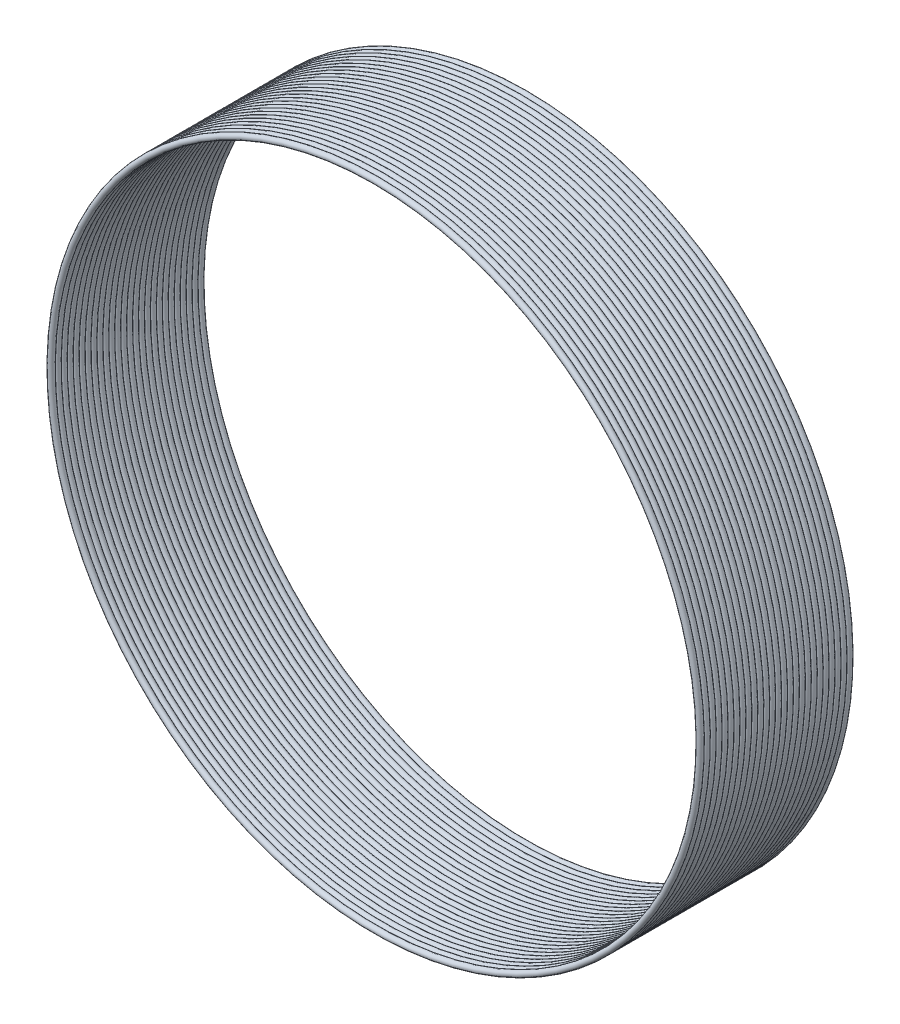
ISO-10303-21;
HEADER;
FILE_DESCRIPTION(('STEP AP214'),'2;1');
FILE_NAME('part.step','',(''),(''),'','','');
FILE_SCHEMA(('AUTOMOTIVE_DESIGN { 1 0 10303 214 1 1 1 1 }'));
ENDSEC;
DATA;
#1=APPLICATION_CONTEXT('core data for automotive mechanical design processes');
#2=APPLICATION_PROTOCOL_DEFINITION('international standard','automotive_design',2000,#1);
#3=PRODUCT_CONTEXT('',#1,'mechanical');
#4=PRODUCT('Part','Part','',(#3));
#5=PRODUCT_RELATED_PRODUCT_CATEGORY('part','',(#4));
#6=PRODUCT_DEFINITION_FORMATION('','',#4);
#7=PRODUCT_DEFINITION_CONTEXT('part definition',#1,'design');
#8=PRODUCT_DEFINITION('design','',#6,#7);
#9=PRODUCT_DEFINITION_SHAPE('','',#8);
#10=(LENGTH_UNIT() NAMED_UNIT(*) SI_UNIT(.MILLI.,.METRE.));
#11=(NAMED_UNIT(*) PLANE_ANGLE_UNIT() SI_UNIT($,.RADIAN.));
#12=(NAMED_UNIT(*) SI_UNIT($,.STERADIAN.) SOLID_ANGLE_UNIT());
#13=UNCERTAINTY_MEASURE_WITH_UNIT(LENGTH_MEASURE(1.E-05),#10,'distance_accuracy_value','');
#14=(GEOMETRIC_REPRESENTATION_CONTEXT(3) GLOBAL_UNCERTAINTY_ASSIGNED_CONTEXT((#13)) GLOBAL_UNIT_ASSIGNED_CONTEXT((#10,
#11,#12)) REPRESENTATION_CONTEXT('',''));
#15=CARTESIAN_POINT('',(0.,0.,0.));
#16=DIRECTION('',(0.,0.,1.));
#17=DIRECTION('',(1.,0.,0.));
#18=AXIS2_PLACEMENT_3D('',#15,#16,#17);
#19=CARTESIAN_POINT('',(0.,0.,-41.76));
#20=DIRECTION('',(0.,0.,-1.));
#21=DIRECTION('',(-1.,0.,0.));
#22=AXIS2_PLACEMENT_3D('',#19,#20,#21);
#23=TOROIDAL_SURFACE('',#22,95.,0.875000000000001);
#24=CARTESIAN_POINT('',(0.,0.,-42.63));
#25=DIRECTION('',(0.,0.,1.));
#26=DIRECTION('',(1.,0.,0.));
#27=AXIS2_PLACEMENT_3D('',#24,#25,#26);
#28=CIRCLE('',#27,94.9065922915465);
#29=CARTESIAN_POINT('',(0.,94.9065922915426,-42.63));
#30=VERTEX_POINT('',#29);
#31=EDGE_CURVE('E11',#30,#30,#28,.T.);
#32=ORIENTED_EDGE('',*,*,#31,.F.);
#33=CARTESIAN_POINT('',(0.,95.,-41.76));
#34=DIRECTION('',(1.,0.,0.));
#35=DIRECTION('',(0.,0.,-1.));
#36=AXIS2_PLACEMENT_3D('',#33,#34,#35);
#37=CIRCLE('',#36,0.875000000000001);
#38=CARTESIAN_POINT('',(0.,94.9065922915426,-40.89));
#39=VERTEX_POINT('',#38);
#40=EDGE_CURVE('E207',#39,#30,#37,.T.);
#41=ORIENTED_EDGE('',*,*,#40,.F.);
#42=CARTESIAN_POINT('',(0.,0.,-40.89));
#43=DIRECTION('',(0.,0.,1.));
#44=DIRECTION('',(1.,0.,0.));
#45=AXIS2_PLACEMENT_3D('',#42,#43,#44);
#46=CIRCLE('',#45,94.9065922915465);
#47=EDGE_CURVE('E420',#39,#39,#46,.T.);
#48=ORIENTED_EDGE('',*,*,#47,.T.);
#49=ORIENTED_EDGE('',*,*,#40,.T.);
#50=EDGE_LOOP('',(#32,#41,#48,#49));
#51=FACE_BOUND('',#50,.T.);
#52=ADVANCED_FACE('F32',(#51),#23,.T.);
#53=CARTESIAN_POINT('',(0.,0.,-40.02));
#54=DIRECTION('',(0.,0.,-1.));
#55=DIRECTION('',(-1.,0.,0.));
#56=AXIS2_PLACEMENT_3D('',#53,#54,#55);
#57=TOROIDAL_SURFACE('',#56,95.,0.875000000000001);
#58=ORIENTED_EDGE('',*,*,#47,.F.);
#59=CARTESIAN_POINT('',(0.,95.,-40.02));
#60=DIRECTION('',(1.,0.,0.));
#61=DIRECTION('',(0.,0.,-1.));
#62=AXIS2_PLACEMENT_3D('',#59,#60,#61);
#63=CIRCLE('',#62,0.875000000000001);
#64=CARTESIAN_POINT('',(0.,94.9065922915426,-39.15));
#65=VERTEX_POINT('',#64);
#66=EDGE_CURVE('E214',#65,#39,#63,.T.);
#67=ORIENTED_EDGE('',*,*,#66,.F.);
#68=CARTESIAN_POINT('',(0.,0.,-39.15));
#69=DIRECTION('',(0.,0.,1.));
#70=DIRECTION('',(1.,0.,0.));
#71=AXIS2_PLACEMENT_3D('',#68,#69,#70);
#72=CIRCLE('',#71,94.9065922915465);
#73=EDGE_CURVE('E416',#65,#65,#72,.T.);
#74=ORIENTED_EDGE('',*,*,#73,.T.);
#75=ORIENTED_EDGE('',*,*,#66,.T.);
#76=EDGE_LOOP('',(#58,#67,#74,#75));
#77=FACE_BOUND('',#76,.T.);
#78=ADVANCED_FACE('F431',(#77),#57,.T.);
#79=CARTESIAN_POINT('',(0.,0.,-38.28));
#80=DIRECTION('',(0.,0.,-1.));
#81=DIRECTION('',(-1.,0.,0.));
#82=AXIS2_PLACEMENT_3D('',#79,#80,#81);
#83=TOROIDAL_SURFACE('',#82,95.,0.875000000000001);
#84=ORIENTED_EDGE('',*,*,#73,.F.);
#85=CARTESIAN_POINT('',(0.,95.,-38.28));
#86=DIRECTION('',(1.,0.,0.));
#87=DIRECTION('',(0.,0.,-1.));
#88=AXIS2_PLACEMENT_3D('',#85,#86,#87);
#89=CIRCLE('',#88,0.875000000000001);
#90=CARTESIAN_POINT('',(0.,94.9065922915426,-37.41));
#91=VERTEX_POINT('',#90);
#92=EDGE_CURVE('E217',#91,#65,#89,.T.);
#93=ORIENTED_EDGE('',*,*,#92,.F.);
#94=CARTESIAN_POINT('',(0.,0.,-37.41));
#95=DIRECTION('',(0.,0.,1.));
#96=DIRECTION('',(1.,0.,0.));
#97=AXIS2_PLACEMENT_3D('',#94,#95,#96);
#98=CIRCLE('',#97,94.9065922915465);
#99=EDGE_CURVE('E410',#91,#91,#98,.T.);
#100=ORIENTED_EDGE('',*,*,#99,.T.);
#101=ORIENTED_EDGE('',*,*,#92,.T.);
#102=EDGE_LOOP('',(#84,#93,#100,#101));
#103=FACE_BOUND('',#102,.T.);
#104=ADVANCED_FACE('F435',(#103),#83,.T.);
#105=CARTESIAN_POINT('',(0.,0.,-36.54));
#106=DIRECTION('',(0.,0.,-1.));
#107=DIRECTION('',(-1.,0.,0.));
#108=AXIS2_PLACEMENT_3D('',#105,#106,#107);
#109=TOROIDAL_SURFACE('',#108,95.,0.875000000000001);
#110=ORIENTED_EDGE('',*,*,#99,.F.);
#111=CARTESIAN_POINT('',(0.,95.,-36.54));
#112=DIRECTION('',(1.,0.,0.));
#113=DIRECTION('',(0.,0.,-1.));
#114=AXIS2_PLACEMENT_3D('',#111,#112,#113);
#115=CIRCLE('',#114,0.875000000000001);
#116=CARTESIAN_POINT('',(0.,94.9065922915426,-35.67));
#117=VERTEX_POINT('',#116);
#118=EDGE_CURVE('E220',#117,#91,#115,.T.);
#119=ORIENTED_EDGE('',*,*,#118,.F.);
#120=CARTESIAN_POINT('',(0.,0.,-35.67));
#121=DIRECTION('',(0.,0.,1.));
#122=DIRECTION('',(1.,0.,0.));
#123=AXIS2_PLACEMENT_3D('',#120,#121,#122);
#124=CIRCLE('',#123,94.9065922915465);
#125=EDGE_CURVE('E404',#117,#117,#124,.T.);
#126=ORIENTED_EDGE('',*,*,#125,.T.);
#127=ORIENTED_EDGE('',*,*,#118,.T.);
#128=EDGE_LOOP('',(#110,#119,#126,#127));
#129=FACE_BOUND('',#128,.T.);
#130=ADVANCED_FACE('F439',(#129),#109,.T.);
#131=CARTESIAN_POINT('',(0.,0.,-34.8));
#132=DIRECTION('',(0.,0.,-1.));
#133=DIRECTION('',(-1.,0.,0.));
#134=AXIS2_PLACEMENT_3D('',#131,#132,#133);
#135=TOROIDAL_SURFACE('',#134,95.,0.875000000000001);
#136=ORIENTED_EDGE('',*,*,#125,.F.);
#137=CARTESIAN_POINT('',(0.,95.,-34.8));
#138=DIRECTION('',(1.,0.,0.));
#139=DIRECTION('',(0.,0.,-1.));
#140=AXIS2_PLACEMENT_3D('',#137,#138,#139);
#141=CIRCLE('',#140,0.875000000000001);
#142=CARTESIAN_POINT('',(0.,94.9065922915426,-33.93));
#143=VERTEX_POINT('',#142);
#144=EDGE_CURVE('E223',#143,#117,#141,.T.);
#145=ORIENTED_EDGE('',*,*,#144,.F.);
#146=CARTESIAN_POINT('',(0.,0.,-33.93));
#147=DIRECTION('',(0.,0.,1.));
#148=DIRECTION('',(1.,0.,0.));
#149=AXIS2_PLACEMENT_3D('',#146,#147,#148);
#150=CIRCLE('',#149,94.9065922915465);
#151=EDGE_CURVE('E398',#143,#143,#150,.T.);
#152=ORIENTED_EDGE('',*,*,#151,.T.);
#153=ORIENTED_EDGE('',*,*,#144,.T.);
#154=EDGE_LOOP('',(#136,#145,#152,#153));
#155=FACE_BOUND('',#154,.T.);
#156=ADVANCED_FACE('F443',(#155),#135,.T.);
#157=CARTESIAN_POINT('',(0.,0.,-33.06));
#158=DIRECTION('',(0.,0.,-1.));
#159=DIRECTION('',(-1.,0.,0.));
#160=AXIS2_PLACEMENT_3D('',#157,#158,#159);
#161=TOROIDAL_SURFACE('',#160,95.,0.875000000000001);
#162=ORIENTED_EDGE('',*,*,#151,.F.);
#163=CARTESIAN_POINT('',(0.,95.,-33.06));
#164=DIRECTION('',(1.,0.,0.));
#165=DIRECTION('',(0.,0.,-1.));
#166=AXIS2_PLACEMENT_3D('',#163,#164,#165);
#167=CIRCLE('',#166,0.875000000000001);
#168=CARTESIAN_POINT('',(0.,94.9065922915426,-32.19));
#169=VERTEX_POINT('',#168);
#170=EDGE_CURVE('E226',#169,#143,#167,.T.);
#171=ORIENTED_EDGE('',*,*,#170,.F.);
#172=CARTESIAN_POINT('',(0.,0.,-32.19));
#173=DIRECTION('',(0.,0.,1.));
#174=DIRECTION('',(1.,0.,0.));
#175=AXIS2_PLACEMENT_3D('',#172,#173,#174);
#176=CIRCLE('',#175,94.9065922915465);
#177=EDGE_CURVE('E392',#169,#169,#176,.T.);
#178=ORIENTED_EDGE('',*,*,#177,.T.);
#179=ORIENTED_EDGE('',*,*,#170,.T.);
#180=EDGE_LOOP('',(#162,#171,#178,#179));
#181=FACE_BOUND('',#180,.T.);
#182=ADVANCED_FACE('F447',(#181),#161,.T.);
#183=CARTESIAN_POINT('',(0.,0.,-31.32));
#184=DIRECTION('',(0.,0.,-1.));
#185=DIRECTION('',(-1.,0.,0.));
#186=AXIS2_PLACEMENT_3D('',#183,#184,#185);
#187=TOROIDAL_SURFACE('',#186,95.,0.875000000000001);
#188=ORIENTED_EDGE('',*,*,#177,.F.);
#189=CARTESIAN_POINT('',(0.,95.,-31.32));
#190=DIRECTION('',(1.,0.,0.));
#191=DIRECTION('',(0.,0.,-1.));
#192=AXIS2_PLACEMENT_3D('',#189,#190,#191);
#193=CIRCLE('',#192,0.875000000000001);
#194=CARTESIAN_POINT('',(0.,94.9065922915426,-30.45));
#195=VERTEX_POINT('',#194);
#196=EDGE_CURVE('E229',#195,#169,#193,.T.);
#197=ORIENTED_EDGE('',*,*,#196,.F.);
#198=CARTESIAN_POINT('',(0.,0.,-30.45));
#199=DIRECTION('',(0.,0.,1.));
#200=DIRECTION('',(1.,0.,0.));
#201=AXIS2_PLACEMENT_3D('',#198,#199,#200);
#202=CIRCLE('',#201,94.9065922915465);
#203=EDGE_CURVE('E386',#195,#195,#202,.T.);
#204=ORIENTED_EDGE('',*,*,#203,.T.);
#205=ORIENTED_EDGE('',*,*,#196,.T.);
#206=EDGE_LOOP('',(#188,#197,#204,#205));
#207=FACE_BOUND('',#206,.T.);
#208=ADVANCED_FACE('F451',(#207),#187,.T.);
#209=CARTESIAN_POINT('',(0.,0.,-29.58));
#210=DIRECTION('',(0.,0.,-1.));
#211=DIRECTION('',(-1.,0.,0.));
#212=AXIS2_PLACEMENT_3D('',#209,#210,#211);
#213=TOROIDAL_SURFACE('',#212,95.,0.875000000000001);
#214=ORIENTED_EDGE('',*,*,#203,.F.);
#215=CARTESIAN_POINT('',(0.,95.,-29.58));
#216=DIRECTION('',(1.,0.,0.));
#217=DIRECTION('',(0.,0.,-1.));
#218=AXIS2_PLACEMENT_3D('',#215,#216,#217);
#219=CIRCLE('',#218,0.875000000000001);
#220=CARTESIAN_POINT('',(0.,94.9065922915426,-28.71));
#221=VERTEX_POINT('',#220);
#222=EDGE_CURVE('E232',#221,#195,#219,.T.);
#223=ORIENTED_EDGE('',*,*,#222,.F.);
#224=CARTESIAN_POINT('',(0.,0.,-28.71));
#225=DIRECTION('',(0.,0.,1.));
#226=DIRECTION('',(1.,0.,0.));
#227=AXIS2_PLACEMENT_3D('',#224,#225,#226);
#228=CIRCLE('',#227,94.9065922915465);
#229=EDGE_CURVE('E380',#221,#221,#228,.T.);
#230=ORIENTED_EDGE('',*,*,#229,.T.);
#231=ORIENTED_EDGE('',*,*,#222,.T.);
#232=EDGE_LOOP('',(#214,#223,#230,#231));
#233=FACE_BOUND('',#232,.T.);
#234=ADVANCED_FACE('F455',(#233),#213,.T.);
#235=CARTESIAN_POINT('',(0.,0.,-27.84));
#236=DIRECTION('',(0.,0.,-1.));
#237=DIRECTION('',(-1.,0.,0.));
#238=AXIS2_PLACEMENT_3D('',#235,#236,#237);
#239=TOROIDAL_SURFACE('',#238,95.,0.875000000000001);
#240=ORIENTED_EDGE('',*,*,#229,.F.);
#241=CARTESIAN_POINT('',(0.,95.,-27.84));
#242=DIRECTION('',(1.,0.,0.));
#243=DIRECTION('',(0.,0.,-1.));
#244=AXIS2_PLACEMENT_3D('',#241,#242,#243);
#245=CIRCLE('',#244,0.875000000000001);
#246=CARTESIAN_POINT('',(0.,94.9065922915426,-26.97));
#247=VERTEX_POINT('',#246);
#248=EDGE_CURVE('E235',#247,#221,#245,.T.);
#249=ORIENTED_EDGE('',*,*,#248,.F.);
#250=CARTESIAN_POINT('',(0.,0.,-26.97));
#251=DIRECTION('',(0.,0.,1.));
#252=DIRECTION('',(1.,0.,0.));
#253=AXIS2_PLACEMENT_3D('',#250,#251,#252);
#254=CIRCLE('',#253,94.9065922915465);
#255=EDGE_CURVE('E374',#247,#247,#254,.T.);
#256=ORIENTED_EDGE('',*,*,#255,.T.);
#257=ORIENTED_EDGE('',*,*,#248,.T.);
#258=EDGE_LOOP('',(#240,#249,#256,#257));
#259=FACE_BOUND('',#258,.T.);
#260=ADVANCED_FACE('F459',(#259),#239,.T.);
#261=CARTESIAN_POINT('',(0.,0.,-26.1));
#262=DIRECTION('',(0.,0.,-1.));
#263=DIRECTION('',(-1.,0.,0.));
#264=AXIS2_PLACEMENT_3D('',#261,#262,#263);
#265=TOROIDAL_SURFACE('',#264,95.,0.875000000000001);
#266=ORIENTED_EDGE('',*,*,#255,.F.);
#267=CARTESIAN_POINT('',(0.,95.,-26.1));
#268=DIRECTION('',(1.,0.,0.));
#269=DIRECTION('',(0.,0.,-1.));
#270=AXIS2_PLACEMENT_3D('',#267,#268,#269);
#271=CIRCLE('',#270,0.875000000000001);
#272=CARTESIAN_POINT('',(0.,94.9065922915426,-25.23));
#273=VERTEX_POINT('',#272);
#274=EDGE_CURVE('E238',#273,#247,#271,.T.);
#275=ORIENTED_EDGE('',*,*,#274,.F.);
#276=CARTESIAN_POINT('',(0.,0.,-25.23));
#277=DIRECTION('',(0.,0.,1.));
#278=DIRECTION('',(1.,0.,0.));
#279=AXIS2_PLACEMENT_3D('',#276,#277,#278);
#280=CIRCLE('',#279,94.9065922915465);
#281=EDGE_CURVE('E368',#273,#273,#280,.T.);
#282=ORIENTED_EDGE('',*,*,#281,.T.);
#283=ORIENTED_EDGE('',*,*,#274,.T.);
#284=EDGE_LOOP('',(#266,#275,#282,#283));
#285=FACE_BOUND('',#284,.T.);
#286=ADVANCED_FACE('F463',(#285),#265,.T.);
#287=CARTESIAN_POINT('',(0.,0.,-24.36));
#288=DIRECTION('',(0.,0.,-1.));
#289=DIRECTION('',(-1.,0.,0.));
#290=AXIS2_PLACEMENT_3D('',#287,#288,#289);
#291=TOROIDAL_SURFACE('',#290,95.,0.875000000000001);
#292=ORIENTED_EDGE('',*,*,#281,.F.);
#293=CARTESIAN_POINT('',(0.,95.,-24.36));
#294=DIRECTION('',(1.,0.,0.));
#295=DIRECTION('',(0.,0.,-1.));
#296=AXIS2_PLACEMENT_3D('',#293,#294,#295);
#297=CIRCLE('',#296,0.875000000000001);
#298=CARTESIAN_POINT('',(0.,94.9065922915426,-23.49));
#299=VERTEX_POINT('',#298);
#300=EDGE_CURVE('E241',#299,#273,#297,.T.);
#301=ORIENTED_EDGE('',*,*,#300,.F.);
#302=CARTESIAN_POINT('',(0.,0.,-23.49));
#303=DIRECTION('',(0.,0.,1.));
#304=DIRECTION('',(1.,0.,0.));
#305=AXIS2_PLACEMENT_3D('',#302,#303,#304);
#306=CIRCLE('',#305,94.9065922915465);
#307=EDGE_CURVE('E362',#299,#299,#306,.T.);
#308=ORIENTED_EDGE('',*,*,#307,.T.);
#309=ORIENTED_EDGE('',*,*,#300,.T.);
#310=EDGE_LOOP('',(#292,#301,#308,#309));
#311=FACE_BOUND('',#310,.T.);
#312=ADVANCED_FACE('F467',(#311),#291,.T.);
#313=CARTESIAN_POINT('',(0.,0.,-22.62));
#314=DIRECTION('',(0.,0.,-1.));
#315=DIRECTION('',(-1.,0.,0.));
#316=AXIS2_PLACEMENT_3D('',#313,#314,#315);
#317=TOROIDAL_SURFACE('',#316,95.,0.875000000000001);
#318=ORIENTED_EDGE('',*,*,#307,.F.);
#319=CARTESIAN_POINT('',(0.,95.,-22.62));
#320=DIRECTION('',(1.,0.,0.));
#321=DIRECTION('',(0.,0.,-1.));
#322=AXIS2_PLACEMENT_3D('',#319,#320,#321);
#323=CIRCLE('',#322,0.875000000000001);
#324=CARTESIAN_POINT('',(0.,94.9065922915426,-21.75));
#325=VERTEX_POINT('',#324);
#326=EDGE_CURVE('E244',#325,#299,#323,.T.);
#327=ORIENTED_EDGE('',*,*,#326,.F.);
#328=CARTESIAN_POINT('',(0.,0.,-21.75));
#329=DIRECTION('',(0.,0.,1.));
#330=DIRECTION('',(1.,0.,0.));
#331=AXIS2_PLACEMENT_3D('',#328,#329,#330);
#332=CIRCLE('',#331,94.9065922915465);
#333=EDGE_CURVE('E356',#325,#325,#332,.T.);
#334=ORIENTED_EDGE('',*,*,#333,.T.);
#335=ORIENTED_EDGE('',*,*,#326,.T.);
#336=EDGE_LOOP('',(#318,#327,#334,#335));
#337=FACE_BOUND('',#336,.T.);
#338=ADVANCED_FACE('F471',(#337),#317,.T.);
#339=CARTESIAN_POINT('',(0.,0.,-20.88));
#340=DIRECTION('',(0.,0.,-1.));
#341=DIRECTION('',(-1.,0.,0.));
#342=AXIS2_PLACEMENT_3D('',#339,#340,#341);
#343=TOROIDAL_SURFACE('',#342,95.,0.875000000000001);
#344=ORIENTED_EDGE('',*,*,#333,.F.);
#345=CARTESIAN_POINT('',(0.,95.,-20.88));
#346=DIRECTION('',(1.,0.,0.));
#347=DIRECTION('',(0.,0.,-1.));
#348=AXIS2_PLACEMENT_3D('',#345,#346,#347);
#349=CIRCLE('',#348,0.875000000000001);
#350=CARTESIAN_POINT('',(0.,94.9065922915426,-20.01));
#351=VERTEX_POINT('',#350);
#352=EDGE_CURVE('E247',#351,#325,#349,.T.);
#353=ORIENTED_EDGE('',*,*,#352,.F.);
#354=CARTESIAN_POINT('',(0.,0.,-20.01));
#355=DIRECTION('',(0.,0.,1.));
#356=DIRECTION('',(1.,0.,0.));
#357=AXIS2_PLACEMENT_3D('',#354,#355,#356);
#358=CIRCLE('',#357,94.9065922915465);
#359=EDGE_CURVE('E350',#351,#351,#358,.T.);
#360=ORIENTED_EDGE('',*,*,#359,.T.);
#361=ORIENTED_EDGE('',*,*,#352,.T.);
#362=EDGE_LOOP('',(#344,#353,#360,#361));
#363=FACE_BOUND('',#362,.T.);
#364=ADVANCED_FACE('F475',(#363),#343,.T.);
#365=CARTESIAN_POINT('',(0.,0.,-19.14));
#366=DIRECTION('',(0.,0.,-1.));
#367=DIRECTION('',(-1.,0.,0.));
#368=AXIS2_PLACEMENT_3D('',#365,#366,#367);
#369=TOROIDAL_SURFACE('',#368,95.,0.875000000000001);
#370=ORIENTED_EDGE('',*,*,#359,.F.);
#371=CARTESIAN_POINT('',(0.,95.,-19.14));
#372=DIRECTION('',(1.,0.,0.));
#373=DIRECTION('',(0.,0.,-1.));
#374=AXIS2_PLACEMENT_3D('',#371,#372,#373);
#375=CIRCLE('',#374,0.875000000000001);
#376=CARTESIAN_POINT('',(0.,94.9065922915426,-18.27));
#377=VERTEX_POINT('',#376);
#378=EDGE_CURVE('E250',#377,#351,#375,.T.);
#379=ORIENTED_EDGE('',*,*,#378,.F.);
#380=CARTESIAN_POINT('',(0.,0.,-18.27));
#381=DIRECTION('',(0.,0.,1.));
#382=DIRECTION('',(1.,0.,0.));
#383=AXIS2_PLACEMENT_3D('',#380,#381,#382);
#384=CIRCLE('',#383,94.9065922915465);
#385=EDGE_CURVE('E344',#377,#377,#384,.T.);
#386=ORIENTED_EDGE('',*,*,#385,.T.);
#387=ORIENTED_EDGE('',*,*,#378,.T.);
#388=EDGE_LOOP('',(#370,#379,#386,#387));
#389=FACE_BOUND('',#388,.T.);
#390=ADVANCED_FACE('F479',(#389),#369,.T.);
#391=CARTESIAN_POINT('',(0.,0.,-17.4));
#392=DIRECTION('',(0.,0.,-1.));
#393=DIRECTION('',(-1.,0.,0.));
#394=AXIS2_PLACEMENT_3D('',#391,#392,#393);
#395=TOROIDAL_SURFACE('',#394,95.,0.875000000000001);
#396=ORIENTED_EDGE('',*,*,#385,.F.);
#397=CARTESIAN_POINT('',(0.,95.,-17.4));
#398=DIRECTION('',(1.,0.,0.));
#399=DIRECTION('',(0.,0.,-1.));
#400=AXIS2_PLACEMENT_3D('',#397,#398,#399);
#401=CIRCLE('',#400,0.875000000000001);
#402=CARTESIAN_POINT('',(0.,94.9065922915426,-16.53));
#403=VERTEX_POINT('',#402);
#404=EDGE_CURVE('E253',#403,#377,#401,.T.);
#405=ORIENTED_EDGE('',*,*,#404,.F.);
#406=CARTESIAN_POINT('',(0.,0.,-16.53));
#407=DIRECTION('',(0.,0.,1.));
#408=DIRECTION('',(1.,0.,0.));
#409=AXIS2_PLACEMENT_3D('',#406,#407,#408);
#410=CIRCLE('',#409,94.9065922915465);
#411=EDGE_CURVE('E338',#403,#403,#410,.T.);
#412=ORIENTED_EDGE('',*,*,#411,.T.);
#413=ORIENTED_EDGE('',*,*,#404,.T.);
#414=EDGE_LOOP('',(#396,#405,#412,#413));
#415=FACE_BOUND('',#414,.T.);
#416=ADVANCED_FACE('F483',(#415),#395,.T.);
#417=CARTESIAN_POINT('',(0.,0.,-15.66));
#418=DIRECTION('',(0.,0.,-1.));
#419=DIRECTION('',(-1.,0.,0.));
#420=AXIS2_PLACEMENT_3D('',#417,#418,#419);
#421=TOROIDAL_SURFACE('',#420,95.,0.875000000000001);
#422=ORIENTED_EDGE('',*,*,#411,.F.);
#423=CARTESIAN_POINT('',(0.,95.,-15.66));
#424=DIRECTION('',(1.,0.,0.));
#425=DIRECTION('',(0.,0.,-1.));
#426=AXIS2_PLACEMENT_3D('',#423,#424,#425);
#427=CIRCLE('',#426,0.875000000000001);
#428=CARTESIAN_POINT('',(0.,94.9065922915426,-14.79));
#429=VERTEX_POINT('',#428);
#430=EDGE_CURVE('E256',#429,#403,#427,.T.);
#431=ORIENTED_EDGE('',*,*,#430,.F.);
#432=CARTESIAN_POINT('',(0.,0.,-14.79));
#433=DIRECTION('',(0.,0.,1.));
#434=DIRECTION('',(1.,0.,0.));
#435=AXIS2_PLACEMENT_3D('',#432,#433,#434);
#436=CIRCLE('',#435,94.9065922915465);
#437=EDGE_CURVE('E332',#429,#429,#436,.T.);
#438=ORIENTED_EDGE('',*,*,#437,.T.);
#439=ORIENTED_EDGE('',*,*,#430,.T.);
#440=EDGE_LOOP('',(#422,#431,#438,#439));
#441=FACE_BOUND('',#440,.T.);
#442=ADVANCED_FACE('F487',(#441),#421,.T.);
#443=CARTESIAN_POINT('',(0.,0.,-13.92));
#444=DIRECTION('',(0.,0.,-1.));
#445=DIRECTION('',(-1.,0.,0.));
#446=AXIS2_PLACEMENT_3D('',#443,#444,#445);
#447=TOROIDAL_SURFACE('',#446,95.,0.875000000000001);
#448=ORIENTED_EDGE('',*,*,#437,.F.);
#449=CARTESIAN_POINT('',(0.,95.,-13.92));
#450=DIRECTION('',(1.,0.,0.));
#451=DIRECTION('',(0.,0.,-1.));
#452=AXIS2_PLACEMENT_3D('',#449,#450,#451);
#453=CIRCLE('',#452,0.875000000000001);
#454=CARTESIAN_POINT('',(0.,94.9065922915426,-13.05));
#455=VERTEX_POINT('',#454);
#456=EDGE_CURVE('E259',#455,#429,#453,.T.);
#457=ORIENTED_EDGE('',*,*,#456,.F.);
#458=CARTESIAN_POINT('',(0.,0.,-13.05));
#459=DIRECTION('',(0.,0.,1.));
#460=DIRECTION('',(1.,0.,0.));
#461=AXIS2_PLACEMENT_3D('',#458,#459,#460);
#462=CIRCLE('',#461,94.9065922915465);
#463=EDGE_CURVE('E326',#455,#455,#462,.T.);
#464=ORIENTED_EDGE('',*,*,#463,.T.);
#465=ORIENTED_EDGE('',*,*,#456,.T.);
#466=EDGE_LOOP('',(#448,#457,#464,#465));
#467=FACE_BOUND('',#466,.T.);
#468=ADVANCED_FACE('F491',(#467),#447,.T.);
#469=CARTESIAN_POINT('',(0.,0.,-12.18));
#470=DIRECTION('',(0.,0.,-1.));
#471=DIRECTION('',(-1.,0.,0.));
#472=AXIS2_PLACEMENT_3D('',#469,#470,#471);
#473=TOROIDAL_SURFACE('',#472,95.,0.875000000000001);
#474=ORIENTED_EDGE('',*,*,#463,.F.);
#475=CARTESIAN_POINT('',(0.,95.,-12.18));
#476=DIRECTION('',(1.,0.,0.));
#477=DIRECTION('',(0.,0.,-1.));
#478=AXIS2_PLACEMENT_3D('',#475,#476,#477);
#479=CIRCLE('',#478,0.875000000000001);
#480=CARTESIAN_POINT('',(0.,94.9065922915426,-11.31));
#481=VERTEX_POINT('',#480);
#482=EDGE_CURVE('E262',#481,#455,#479,.T.);
#483=ORIENTED_EDGE('',*,*,#482,.F.);
#484=CARTESIAN_POINT('',(0.,0.,-11.31));
#485=DIRECTION('',(0.,0.,1.));
#486=DIRECTION('',(1.,0.,0.));
#487=AXIS2_PLACEMENT_3D('',#484,#485,#486);
#488=CIRCLE('',#487,94.9065922915465);
#489=EDGE_CURVE('E320',#481,#481,#488,.T.);
#490=ORIENTED_EDGE('',*,*,#489,.T.);
#491=ORIENTED_EDGE('',*,*,#482,.T.);
#492=EDGE_LOOP('',(#474,#483,#490,#491));
#493=FACE_BOUND('',#492,.T.);
#494=ADVANCED_FACE('F495',(#493),#473,.T.);
#495=CARTESIAN_POINT('',(0.,0.,-10.44));
#496=DIRECTION('',(0.,0.,-1.));
#497=DIRECTION('',(-1.,0.,0.));
#498=AXIS2_PLACEMENT_3D('',#495,#496,#497);
#499=TOROIDAL_SURFACE('',#498,95.,0.875000000000001);
#500=ORIENTED_EDGE('',*,*,#489,.F.);
#501=CARTESIAN_POINT('',(0.,95.,-10.44));
#502=DIRECTION('',(1.,0.,0.));
#503=DIRECTION('',(0.,0.,-1.));
#504=AXIS2_PLACEMENT_3D('',#501,#502,#503);
#505=CIRCLE('',#504,0.875000000000001);
#506=CARTESIAN_POINT('',(0.,94.9065922915426,-9.57));
#507=VERTEX_POINT('',#506);
#508=EDGE_CURVE('E265',#507,#481,#505,.T.);
#509=ORIENTED_EDGE('',*,*,#508,.F.);
#510=CARTESIAN_POINT('',(0.,0.,-9.57));
#511=DIRECTION('',(0.,0.,1.));
#512=DIRECTION('',(1.,0.,0.));
#513=AXIS2_PLACEMENT_3D('',#510,#511,#512);
#514=CIRCLE('',#513,94.9065922915465);
#515=EDGE_CURVE('E314',#507,#507,#514,.T.);
#516=ORIENTED_EDGE('',*,*,#515,.T.);
#517=ORIENTED_EDGE('',*,*,#508,.T.);
#518=EDGE_LOOP('',(#500,#509,#516,#517));
#519=FACE_BOUND('',#518,.T.);
#520=ADVANCED_FACE('F499',(#519),#499,.T.);
#521=CARTESIAN_POINT('',(0.,0.,-8.7));
#522=DIRECTION('',(0.,0.,-1.));
#523=DIRECTION('',(-1.,0.,0.));
#524=AXIS2_PLACEMENT_3D('',#521,#522,#523);
#525=TOROIDAL_SURFACE('',#524,95.,0.875000000000001);
#526=ORIENTED_EDGE('',*,*,#515,.F.);
#527=CARTESIAN_POINT('',(0.,95.,-8.7));
#528=DIRECTION('',(1.,0.,0.));
#529=DIRECTION('',(0.,0.,-1.));
#530=AXIS2_PLACEMENT_3D('',#527,#528,#529);
#531=CIRCLE('',#530,0.875000000000001);
#532=CARTESIAN_POINT('',(0.,94.9065922915426,-7.83));
#533=VERTEX_POINT('',#532);
#534=EDGE_CURVE('E268',#533,#507,#531,.T.);
#535=ORIENTED_EDGE('',*,*,#534,.F.);
#536=CARTESIAN_POINT('',(0.,0.,-7.83));
#537=DIRECTION('',(0.,0.,1.));
#538=DIRECTION('',(1.,0.,0.));
#539=AXIS2_PLACEMENT_3D('',#536,#537,#538);
#540=CIRCLE('',#539,94.9065922915465);
#541=EDGE_CURVE('E308',#533,#533,#540,.T.);
#542=ORIENTED_EDGE('',*,*,#541,.T.);
#543=ORIENTED_EDGE('',*,*,#534,.T.);
#544=EDGE_LOOP('',(#526,#535,#542,#543));
#545=FACE_BOUND('',#544,.T.);
#546=ADVANCED_FACE('F503',(#545),#525,.T.);
#547=CARTESIAN_POINT('',(0.,0.,-6.96));
#548=DIRECTION('',(0.,0.,-1.));
#549=DIRECTION('',(-1.,0.,0.));
#550=AXIS2_PLACEMENT_3D('',#547,#548,#549);
#551=TOROIDAL_SURFACE('',#550,95.,0.875000000000001);
#552=ORIENTED_EDGE('',*,*,#541,.F.);
#553=CARTESIAN_POINT('',(0.,95.,-6.96));
#554=DIRECTION('',(1.,0.,0.));
#555=DIRECTION('',(0.,0.,-1.));
#556=AXIS2_PLACEMENT_3D('',#553,#554,#555);
#557=CIRCLE('',#556,0.875000000000001);
#558=CARTESIAN_POINT('',(0.,94.9065922915426,-6.09));
#559=VERTEX_POINT('',#558);
#560=EDGE_CURVE('E271',#559,#533,#557,.T.);
#561=ORIENTED_EDGE('',*,*,#560,.F.);
#562=CARTESIAN_POINT('',(0.,0.,-6.09));
#563=DIRECTION('',(0.,0.,1.));
#564=DIRECTION('',(1.,0.,0.));
#565=AXIS2_PLACEMENT_3D('',#562,#563,#564);
#566=CIRCLE('',#565,94.9065922915465);
#567=EDGE_CURVE('E302',#559,#559,#566,.T.);
#568=ORIENTED_EDGE('',*,*,#567,.T.);
#569=ORIENTED_EDGE('',*,*,#560,.T.);
#570=EDGE_LOOP('',(#552,#561,#568,#569));
#571=FACE_BOUND('',#570,.T.);
#572=ADVANCED_FACE('F507',(#571),#551,.T.);
#573=CARTESIAN_POINT('',(0.,0.,-5.22));
#574=DIRECTION('',(0.,0.,-1.));
#575=DIRECTION('',(-1.,0.,0.));
#576=AXIS2_PLACEMENT_3D('',#573,#574,#575);
#577=TOROIDAL_SURFACE('',#576,95.,0.875000000000001);
#578=ORIENTED_EDGE('',*,*,#567,.F.);
#579=CARTESIAN_POINT('',(0.,95.,-5.22));
#580=DIRECTION('',(1.,0.,0.));
#581=DIRECTION('',(0.,0.,-1.));
#582=AXIS2_PLACEMENT_3D('',#579,#580,#581);
#583=CIRCLE('',#582,0.875000000000001);
#584=CARTESIAN_POINT('',(0.,94.9065922915426,-4.35));
#585=VERTEX_POINT('',#584);
#586=EDGE_CURVE('E274',#585,#559,#583,.T.);
#587=ORIENTED_EDGE('',*,*,#586,.F.);
#588=CARTESIAN_POINT('',(0.,0.,-4.35));
#589=DIRECTION('',(0.,0.,1.));
#590=DIRECTION('',(1.,0.,0.));
#591=AXIS2_PLACEMENT_3D('',#588,#589,#590);
#592=CIRCLE('',#591,94.9065922915465);
#593=EDGE_CURVE('E296',#585,#585,#592,.T.);
#594=ORIENTED_EDGE('',*,*,#593,.T.);
#595=ORIENTED_EDGE('',*,*,#586,.T.);
#596=EDGE_LOOP('',(#578,#587,#594,#595));
#597=FACE_BOUND('',#596,.T.);
#598=ADVANCED_FACE('F511',(#597),#577,.T.);
#599=CARTESIAN_POINT('',(0.,0.,-3.48));
#600=DIRECTION('',(0.,0.,-1.));
#601=DIRECTION('',(-1.,0.,0.));
#602=AXIS2_PLACEMENT_3D('',#599,#600,#601);
#603=TOROIDAL_SURFACE('',#602,95.,0.875000000000001);
#604=ORIENTED_EDGE('',*,*,#593,.F.);
#605=CARTESIAN_POINT('',(0.,95.,-3.48));
#606=DIRECTION('',(1.,0.,0.));
#607=DIRECTION('',(0.,0.,-1.));
#608=AXIS2_PLACEMENT_3D('',#605,#606,#607);
#609=CIRCLE('',#608,0.875000000000001);
#610=CARTESIAN_POINT('',(0.,94.9065922915333,-2.61));
#611=VERTEX_POINT('',#610);
#612=EDGE_CURVE('E277',#611,#585,#609,.T.);
#613=ORIENTED_EDGE('',*,*,#612,.F.);
#614=CARTESIAN_POINT('',(0.,0.,-2.61));
#615=DIRECTION('',(0.,0.,1.));
#616=DIRECTION('',(1.,0.,0.));
#617=AXIS2_PLACEMENT_3D('',#614,#615,#616);
#618=CIRCLE('',#617,94.906592291528);
#619=EDGE_CURVE('E290',#611,#611,#618,.T.);
#620=ORIENTED_EDGE('',*,*,#619,.T.);
#621=ORIENTED_EDGE('',*,*,#612,.T.);
#622=EDGE_LOOP('',(#604,#613,#620,#621));
#623=FACE_BOUND('',#622,.T.);
#624=ADVANCED_FACE('F515',(#623),#603,.T.);
#625=CARTESIAN_POINT('',(0.,0.,-1.74));
#626=DIRECTION('',(0.,0.,-1.));
#627=DIRECTION('',(-1.,0.,0.));
#628=AXIS2_PLACEMENT_3D('',#625,#626,#627);
#629=TOROIDAL_SURFACE('',#628,95.,0.875000000000001);
#630=ORIENTED_EDGE('',*,*,#619,.F.);
#631=CARTESIAN_POINT('',(0.,95.,-1.74));
#632=DIRECTION('',(1.,0.,0.));
#633=DIRECTION('',(0.,0.,-1.));
#634=AXIS2_PLACEMENT_3D('',#631,#632,#633);
#635=CIRCLE('',#634,0.875000000000001);
#636=CARTESIAN_POINT('',(0.,94.9065922915333,-0.87));
#637=VERTEX_POINT('',#636);
#638=EDGE_CURVE('E279',#637,#611,#635,.T.);
#639=ORIENTED_EDGE('',*,*,#638,.F.);
#640=CARTESIAN_POINT('',(0.,0.,-0.87));
#641=DIRECTION('',(0.,0.,1.));
#642=DIRECTION('',(1.,0.,0.));
#643=AXIS2_PLACEMENT_3D('',#640,#641,#642);
#644=CIRCLE('',#643,94.906592291528);
#645=EDGE_CURVE('E284',#637,#637,#644,.T.);
#646=ORIENTED_EDGE('',*,*,#645,.T.);
#647=ORIENTED_EDGE('',*,*,#638,.T.);
#648=EDGE_LOOP('',(#630,#639,#646,#647));
#649=FACE_BOUND('',#648,.T.);
#650=ADVANCED_FACE('F519',(#649),#629,.T.);
#651=CARTESIAN_POINT('',(0.,0.,0.));
#652=DIRECTION('',(0.,0.,-1.));
#653=DIRECTION('',(-1.,0.,0.));
#654=AXIS2_PLACEMENT_3D('',#651,#652,#653);
#655=TOROIDAL_SURFACE('',#654,95.,0.875000000000001);
#656=ORIENTED_EDGE('',*,*,#645,.F.);
#657=CARTESIAN_POINT('',(0.,95.,0.));
#658=DIRECTION('',(1.,0.,0.));
#659=DIRECTION('',(0.,0.,-1.));
#660=AXIS2_PLACEMENT_3D('',#657,#658,#659);
#661=CIRCLE('',#660,0.875000000000001);
#662=CARTESIAN_POINT('',(0.,95.0934077084667,-0.87));
#663=VERTEX_POINT('',#662);
#664=EDGE_CURVE('E47',#663,#637,#661,.T.);
#665=ORIENTED_EDGE('',*,*,#664,.F.);
#666=CARTESIAN_POINT('',(0.,0.,-0.87));
#667=DIRECTION('',(0.,0.,-1.));
#668=DIRECTION('',(-1.,0.,0.));
#669=AXIS2_PLACEMENT_3D('',#666,#667,#668);
#670=CIRCLE('',#669,95.0934077084721);
#671=EDGE_CURVE('E282',#663,#663,#670,.T.);
#672=ORIENTED_EDGE('',*,*,#671,.F.);
#673=ORIENTED_EDGE('',*,*,#664,.T.);
#674=EDGE_LOOP('',(#656,#665,#672,#673));
#675=FACE_BOUND('',#674,.T.);
#676=ADVANCED_FACE('F34',(#675),#655,.T.);
#677=CARTESIAN_POINT('',(0.,0.,-2.61));
#678=DIRECTION('',(0.,0.,-1.));
#679=DIRECTION('',(-1.,0.,0.));
#680=AXIS2_PLACEMENT_3D('',#677,#678,#679);
#681=CIRCLE('',#680,95.0934077084721);
#682=CARTESIAN_POINT('',(0.,95.0934077084667,-2.61));
#683=VERTEX_POINT('',#682);
#684=EDGE_CURVE('E287',#683,#683,#681,.T.);
#685=ORIENTED_EDGE('',*,*,#684,.F.);
#686=EDGE_CURVE('E54',#683,#663,#635,.T.);
#687=ORIENTED_EDGE('',*,*,#686,.T.);
#688=ORIENTED_EDGE('',*,*,#671,.T.);
#689=ORIENTED_EDGE('',*,*,#686,.F.);
#690=EDGE_LOOP('',(#685,#687,#688,#689));
#691=FACE_BOUND('',#690,.T.);
#692=ADVANCED_FACE('F520',(#691),#629,.T.);
#693=CARTESIAN_POINT('',(0.,0.,-4.35));
#694=DIRECTION('',(0.,0.,-1.));
#695=DIRECTION('',(-1.,0.,0.));
#696=AXIS2_PLACEMENT_3D('',#693,#694,#695);
#697=CIRCLE('',#696,95.0934077084535);
#698=CARTESIAN_POINT('',(0.,95.0934077084574,-4.35));
#699=VERTEX_POINT('',#698);
#700=EDGE_CURVE('E293',#699,#699,#697,.T.);
#701=ORIENTED_EDGE('',*,*,#700,.F.);
#702=EDGE_CURVE('E276',#699,#683,#609,.T.);
#703=ORIENTED_EDGE('',*,*,#702,.T.);
#704=ORIENTED_EDGE('',*,*,#684,.T.);
#705=ORIENTED_EDGE('',*,*,#702,.F.);
#706=EDGE_LOOP('',(#701,#703,#704,#705));
#707=FACE_BOUND('',#706,.T.);
#708=ADVANCED_FACE('F524',(#707),#603,.T.);
#709=CARTESIAN_POINT('',(0.,0.,-6.09));
#710=DIRECTION('',(0.,0.,-1.));
#711=DIRECTION('',(-1.,0.,0.));
#712=AXIS2_PLACEMENT_3D('',#709,#710,#711);
#713=CIRCLE('',#712,95.0934077084535);
#714=CARTESIAN_POINT('',(0.,95.0934077084574,-6.09));
#715=VERTEX_POINT('',#714);
#716=EDGE_CURVE('E299',#715,#715,#713,.T.);
#717=ORIENTED_EDGE('',*,*,#716,.F.);
#718=EDGE_CURVE('E273',#715,#699,#583,.T.);
#719=ORIENTED_EDGE('',*,*,#718,.T.);
#720=ORIENTED_EDGE('',*,*,#700,.T.);
#721=ORIENTED_EDGE('',*,*,#718,.F.);
#722=EDGE_LOOP('',(#717,#719,#720,#721));
#723=FACE_BOUND('',#722,.T.);
#724=ADVANCED_FACE('F528',(#723),#577,.T.);
#725=CARTESIAN_POINT('',(0.,0.,-7.83));
#726=DIRECTION('',(0.,0.,-1.));
#727=DIRECTION('',(-1.,0.,0.));
#728=AXIS2_PLACEMENT_3D('',#725,#726,#727);
#729=CIRCLE('',#728,95.0934077084535);
#730=CARTESIAN_POINT('',(0.,95.0934077084574,-7.83));
#731=VERTEX_POINT('',#730);
#732=EDGE_CURVE('E305',#731,#731,#729,.T.);
#733=ORIENTED_EDGE('',*,*,#732,.F.);
#734=EDGE_CURVE('E270',#731,#715,#557,.T.);
#735=ORIENTED_EDGE('',*,*,#734,.T.);
#736=ORIENTED_EDGE('',*,*,#716,.T.);
#737=ORIENTED_EDGE('',*,*,#734,.F.);
#738=EDGE_LOOP('',(#733,#735,#736,#737));
#739=FACE_BOUND('',#738,.T.);
#740=ADVANCED_FACE('F532',(#739),#551,.T.);
#741=CARTESIAN_POINT('',(0.,0.,-9.57));
#742=DIRECTION('',(0.,0.,-1.));
#743=DIRECTION('',(-1.,0.,0.));
#744=AXIS2_PLACEMENT_3D('',#741,#742,#743);
#745=CIRCLE('',#744,95.0934077084535);
#746=CARTESIAN_POINT('',(0.,95.0934077084574,-9.57));
#747=VERTEX_POINT('',#746);
#748=EDGE_CURVE('E311',#747,#747,#745,.T.);
#749=ORIENTED_EDGE('',*,*,#748,.F.);
#750=EDGE_CURVE('E267',#747,#731,#531,.T.);
#751=ORIENTED_EDGE('',*,*,#750,.T.);
#752=ORIENTED_EDGE('',*,*,#732,.T.);
#753=ORIENTED_EDGE('',*,*,#750,.F.);
#754=EDGE_LOOP('',(#749,#751,#752,#753));
#755=FACE_BOUND('',#754,.T.);
#756=ADVANCED_FACE('F536',(#755),#525,.T.);
#757=CARTESIAN_POINT('',(0.,0.,-11.31));
#758=DIRECTION('',(0.,0.,-1.));
#759=DIRECTION('',(-1.,0.,0.));
#760=AXIS2_PLACEMENT_3D('',#757,#758,#759);
#761=CIRCLE('',#760,95.0934077084535);
#762=CARTESIAN_POINT('',(0.,95.0934077084574,-11.31));
#763=VERTEX_POINT('',#762);
#764=EDGE_CURVE('E317',#763,#763,#761,.T.);
#765=ORIENTED_EDGE('',*,*,#764,.F.);
#766=EDGE_CURVE('E264',#763,#747,#505,.T.);
#767=ORIENTED_EDGE('',*,*,#766,.T.);
#768=ORIENTED_EDGE('',*,*,#748,.T.);
#769=ORIENTED_EDGE('',*,*,#766,.F.);
#770=EDGE_LOOP('',(#765,#767,#768,#769));
#771=FACE_BOUND('',#770,.T.);
#772=ADVANCED_FACE('F540',(#771),#499,.T.);
#773=CARTESIAN_POINT('',(0.,0.,-13.05));
#774=DIRECTION('',(0.,0.,-1.));
#775=DIRECTION('',(-1.,0.,0.));
#776=AXIS2_PLACEMENT_3D('',#773,#774,#775);
#777=CIRCLE('',#776,95.0934077084535);
#778=CARTESIAN_POINT('',(0.,95.0934077084574,-13.05));
#779=VERTEX_POINT('',#778);
#780=EDGE_CURVE('E323',#779,#779,#777,.T.);
#781=ORIENTED_EDGE('',*,*,#780,.F.);
#782=EDGE_CURVE('E261',#779,#763,#479,.T.);
#783=ORIENTED_EDGE('',*,*,#782,.T.);
#784=ORIENTED_EDGE('',*,*,#764,.T.);
#785=ORIENTED_EDGE('',*,*,#782,.F.);
#786=EDGE_LOOP('',(#781,#783,#784,#785));
#787=FACE_BOUND('',#786,.T.);
#788=ADVANCED_FACE('F544',(#787),#473,.T.);
#789=CARTESIAN_POINT('',(0.,0.,-14.79));
#790=DIRECTION('',(0.,0.,-1.));
#791=DIRECTION('',(-1.,0.,0.));
#792=AXIS2_PLACEMENT_3D('',#789,#790,#791);
#793=CIRCLE('',#792,95.0934077084535);
#794=CARTESIAN_POINT('',(0.,95.0934077084574,-14.79));
#795=VERTEX_POINT('',#794);
#796=EDGE_CURVE('E329',#795,#795,#793,.T.);
#797=ORIENTED_EDGE('',*,*,#796,.F.);
#798=EDGE_CURVE('E258',#795,#779,#453,.T.);
#799=ORIENTED_EDGE('',*,*,#798,.T.);
#800=ORIENTED_EDGE('',*,*,#780,.T.);
#801=ORIENTED_EDGE('',*,*,#798,.F.);
#802=EDGE_LOOP('',(#797,#799,#800,#801));
#803=FACE_BOUND('',#802,.T.);
#804=ADVANCED_FACE('F548',(#803),#447,.T.);
#805=CARTESIAN_POINT('',(0.,0.,-16.53));
#806=DIRECTION('',(0.,0.,-1.));
#807=DIRECTION('',(-1.,0.,0.));
#808=AXIS2_PLACEMENT_3D('',#805,#806,#807);
#809=CIRCLE('',#808,95.0934077084535);
#810=CARTESIAN_POINT('',(0.,95.0934077084574,-16.53));
#811=VERTEX_POINT('',#810);
#812=EDGE_CURVE('E335',#811,#811,#809,.T.);
#813=ORIENTED_EDGE('',*,*,#812,.F.);
#814=EDGE_CURVE('E255',#811,#795,#427,.T.);
#815=ORIENTED_EDGE('',*,*,#814,.T.);
#816=ORIENTED_EDGE('',*,*,#796,.T.);
#817=ORIENTED_EDGE('',*,*,#814,.F.);
#818=EDGE_LOOP('',(#813,#815,#816,#817));
#819=FACE_BOUND('',#818,.T.);
#820=ADVANCED_FACE('F552',(#819),#421,.T.);
#821=CARTESIAN_POINT('',(0.,0.,-18.27));
#822=DIRECTION('',(0.,0.,-1.));
#823=DIRECTION('',(-1.,0.,0.));
#824=AXIS2_PLACEMENT_3D('',#821,#822,#823);
#825=CIRCLE('',#824,95.0934077084535);
#826=CARTESIAN_POINT('',(0.,95.0934077084574,-18.27));
#827=VERTEX_POINT('',#826);
#828=EDGE_CURVE('E341',#827,#827,#825,.T.);
#829=ORIENTED_EDGE('',*,*,#828,.F.);
#830=EDGE_CURVE('E252',#827,#811,#401,.T.);
#831=ORIENTED_EDGE('',*,*,#830,.T.);
#832=ORIENTED_EDGE('',*,*,#812,.T.);
#833=ORIENTED_EDGE('',*,*,#830,.F.);
#834=EDGE_LOOP('',(#829,#831,#832,#833));
#835=FACE_BOUND('',#834,.T.);
#836=ADVANCED_FACE('F556',(#835),#395,.T.);
#837=CARTESIAN_POINT('',(0.,0.,-20.01));
#838=DIRECTION('',(0.,0.,-1.));
#839=DIRECTION('',(-1.,0.,0.));
#840=AXIS2_PLACEMENT_3D('',#837,#838,#839);
#841=CIRCLE('',#840,95.0934077084535);
#842=CARTESIAN_POINT('',(0.,95.0934077084574,-20.01));
#843=VERTEX_POINT('',#842);
#844=EDGE_CURVE('E347',#843,#843,#841,.T.);
#845=ORIENTED_EDGE('',*,*,#844,.F.);
#846=EDGE_CURVE('E249',#843,#827,#375,.T.);
#847=ORIENTED_EDGE('',*,*,#846,.T.);
#848=ORIENTED_EDGE('',*,*,#828,.T.);
#849=ORIENTED_EDGE('',*,*,#846,.F.);
#850=EDGE_LOOP('',(#845,#847,#848,#849));
#851=FACE_BOUND('',#850,.T.);
#852=ADVANCED_FACE('F560',(#851),#369,.T.);
#853=CARTESIAN_POINT('',(0.,0.,-21.75));
#854=DIRECTION('',(0.,0.,-1.));
#855=DIRECTION('',(-1.,0.,0.));
#856=AXIS2_PLACEMENT_3D('',#853,#854,#855);
#857=CIRCLE('',#856,95.0934077084535);
#858=CARTESIAN_POINT('',(0.,95.0934077084574,-21.75));
#859=VERTEX_POINT('',#858);
#860=EDGE_CURVE('E353',#859,#859,#857,.T.);
#861=ORIENTED_EDGE('',*,*,#860,.F.);
#862=EDGE_CURVE('E246',#859,#843,#349,.T.);
#863=ORIENTED_EDGE('',*,*,#862,.T.);
#864=ORIENTED_EDGE('',*,*,#844,.T.);
#865=ORIENTED_EDGE('',*,*,#862,.F.);
#866=EDGE_LOOP('',(#861,#863,#864,#865));
#867=FACE_BOUND('',#866,.T.);
#868=ADVANCED_FACE('F564',(#867),#343,.T.);
#869=CARTESIAN_POINT('',(0.,0.,-23.49));
#870=DIRECTION('',(0.,0.,-1.));
#871=DIRECTION('',(-1.,0.,0.));
#872=AXIS2_PLACEMENT_3D('',#869,#870,#871);
#873=CIRCLE('',#872,95.0934077084535);
#874=CARTESIAN_POINT('',(0.,95.0934077084574,-23.49));
#875=VERTEX_POINT('',#874);
#876=EDGE_CURVE('E359',#875,#875,#873,.T.);
#877=ORIENTED_EDGE('',*,*,#876,.F.);
#878=EDGE_CURVE('E243',#875,#859,#323,.T.);
#879=ORIENTED_EDGE('',*,*,#878,.T.);
#880=ORIENTED_EDGE('',*,*,#860,.T.);
#881=ORIENTED_EDGE('',*,*,#878,.F.);
#882=EDGE_LOOP('',(#877,#879,#880,#881));
#883=FACE_BOUND('',#882,.T.);
#884=ADVANCED_FACE('F568',(#883),#317,.T.);
#885=CARTESIAN_POINT('',(0.,0.,-25.23));
#886=DIRECTION('',(0.,0.,-1.));
#887=DIRECTION('',(-1.,0.,0.));
#888=AXIS2_PLACEMENT_3D('',#885,#886,#887);
#889=CIRCLE('',#888,95.0934077084535);
#890=CARTESIAN_POINT('',(0.,95.0934077084574,-25.23));
#891=VERTEX_POINT('',#890);
#892=EDGE_CURVE('E365',#891,#891,#889,.T.);
#893=ORIENTED_EDGE('',*,*,#892,.F.);
#894=EDGE_CURVE('E240',#891,#875,#297,.T.);
#895=ORIENTED_EDGE('',*,*,#894,.T.);
#896=ORIENTED_EDGE('',*,*,#876,.T.);
#897=ORIENTED_EDGE('',*,*,#894,.F.);
#898=EDGE_LOOP('',(#893,#895,#896,#897));
#899=FACE_BOUND('',#898,.T.);
#900=ADVANCED_FACE('F572',(#899),#291,.T.);
#901=CARTESIAN_POINT('',(0.,0.,-26.97));
#902=DIRECTION('',(0.,0.,-1.));
#903=DIRECTION('',(-1.,0.,0.));
#904=AXIS2_PLACEMENT_3D('',#901,#902,#903);
#905=CIRCLE('',#904,95.0934077084535);
#906=CARTESIAN_POINT('',(0.,95.0934077084574,-26.97));
#907=VERTEX_POINT('',#906);
#908=EDGE_CURVE('E371',#907,#907,#905,.T.);
#909=ORIENTED_EDGE('',*,*,#908,.F.);
#910=EDGE_CURVE('E237',#907,#891,#271,.T.);
#911=ORIENTED_EDGE('',*,*,#910,.T.);
#912=ORIENTED_EDGE('',*,*,#892,.T.);
#913=ORIENTED_EDGE('',*,*,#910,.F.);
#914=EDGE_LOOP('',(#909,#911,#912,#913));
#915=FACE_BOUND('',#914,.T.);
#916=ADVANCED_FACE('F576',(#915),#265,.T.);
#917=CARTESIAN_POINT('',(0.,0.,-28.71));
#918=DIRECTION('',(0.,0.,-1.));
#919=DIRECTION('',(-1.,0.,0.));
#920=AXIS2_PLACEMENT_3D('',#917,#918,#919);
#921=CIRCLE('',#920,95.0934077084535);
#922=CARTESIAN_POINT('',(0.,95.0934077084574,-28.71));
#923=VERTEX_POINT('',#922);
#924=EDGE_CURVE('E377',#923,#923,#921,.T.);
#925=ORIENTED_EDGE('',*,*,#924,.F.);
#926=EDGE_CURVE('E234',#923,#907,#245,.T.);
#927=ORIENTED_EDGE('',*,*,#926,.T.);
#928=ORIENTED_EDGE('',*,*,#908,.T.);
#929=ORIENTED_EDGE('',*,*,#926,.F.);
#930=EDGE_LOOP('',(#925,#927,#928,#929));
#931=FACE_BOUND('',#930,.T.);
#932=ADVANCED_FACE('F580',(#931),#239,.T.);
#933=CARTESIAN_POINT('',(0.,0.,-30.45));
#934=DIRECTION('',(0.,0.,-1.));
#935=DIRECTION('',(-1.,0.,0.));
#936=AXIS2_PLACEMENT_3D('',#933,#934,#935);
#937=CIRCLE('',#936,95.0934077084535);
#938=CARTESIAN_POINT('',(0.,95.0934077084574,-30.45));
#939=VERTEX_POINT('',#938);
#940=EDGE_CURVE('E383',#939,#939,#937,.T.);
#941=ORIENTED_EDGE('',*,*,#940,.F.);
#942=EDGE_CURVE('E231',#939,#923,#219,.T.);
#943=ORIENTED_EDGE('',*,*,#942,.T.);
#944=ORIENTED_EDGE('',*,*,#924,.T.);
#945=ORIENTED_EDGE('',*,*,#942,.F.);
#946=EDGE_LOOP('',(#941,#943,#944,#945));
#947=FACE_BOUND('',#946,.T.);
#948=ADVANCED_FACE('F584',(#947),#213,.T.);
#949=CARTESIAN_POINT('',(0.,0.,-32.19));
#950=DIRECTION('',(0.,0.,-1.));
#951=DIRECTION('',(-1.,0.,0.));
#952=AXIS2_PLACEMENT_3D('',#949,#950,#951);
#953=CIRCLE('',#952,95.0934077084535);
#954=CARTESIAN_POINT('',(0.,95.0934077084574,-32.19));
#955=VERTEX_POINT('',#954);
#956=EDGE_CURVE('E389',#955,#955,#953,.T.);
#957=ORIENTED_EDGE('',*,*,#956,.F.);
#958=EDGE_CURVE('E228',#955,#939,#193,.T.);
#959=ORIENTED_EDGE('',*,*,#958,.T.);
#960=ORIENTED_EDGE('',*,*,#940,.T.);
#961=ORIENTED_EDGE('',*,*,#958,.F.);
#962=EDGE_LOOP('',(#957,#959,#960,#961));
#963=FACE_BOUND('',#962,.T.);
#964=ADVANCED_FACE('F588',(#963),#187,.T.);
#965=CARTESIAN_POINT('',(0.,0.,-33.93));
#966=DIRECTION('',(0.,0.,-1.));
#967=DIRECTION('',(-1.,0.,0.));
#968=AXIS2_PLACEMENT_3D('',#965,#966,#967);
#969=CIRCLE('',#968,95.0934077084535);
#970=CARTESIAN_POINT('',(0.,95.0934077084574,-33.93));
#971=VERTEX_POINT('',#970);
#972=EDGE_CURVE('E395',#971,#971,#969,.T.);
#973=ORIENTED_EDGE('',*,*,#972,.F.);
#974=EDGE_CURVE('E225',#971,#955,#167,.T.);
#975=ORIENTED_EDGE('',*,*,#974,.T.);
#976=ORIENTED_EDGE('',*,*,#956,.T.);
#977=ORIENTED_EDGE('',*,*,#974,.F.);
#978=EDGE_LOOP('',(#973,#975,#976,#977));
#979=FACE_BOUND('',#978,.T.);
#980=ADVANCED_FACE('F592',(#979),#161,.T.);
#981=CARTESIAN_POINT('',(0.,0.,-35.67));
#982=DIRECTION('',(0.,0.,-1.));
#983=DIRECTION('',(-1.,0.,0.));
#984=AXIS2_PLACEMENT_3D('',#981,#982,#983);
#985=CIRCLE('',#984,95.0934077084535);
#986=CARTESIAN_POINT('',(0.,95.0934077084574,-35.67));
#987=VERTEX_POINT('',#986);
#988=EDGE_CURVE('E401',#987,#987,#985,.T.);
#989=ORIENTED_EDGE('',*,*,#988,.F.);
#990=EDGE_CURVE('E222',#987,#971,#141,.T.);
#991=ORIENTED_EDGE('',*,*,#990,.T.);
#992=ORIENTED_EDGE('',*,*,#972,.T.);
#993=ORIENTED_EDGE('',*,*,#990,.F.);
#994=EDGE_LOOP('',(#989,#991,#992,#993));
#995=FACE_BOUND('',#994,.T.);
#996=ADVANCED_FACE('F596',(#995),#135,.T.);
#997=CARTESIAN_POINT('',(0.,0.,-37.41));
#998=DIRECTION('',(0.,0.,-1.));
#999=DIRECTION('',(-1.,0.,0.));
#1000=AXIS2_PLACEMENT_3D('',#997,#998,#999);
#1001=CIRCLE('',#1000,95.0934077084535);
#1002=CARTESIAN_POINT('',(0.,95.0934077084574,-37.41));
#1003=VERTEX_POINT('',#1002);
#1004=EDGE_CURVE('E407',#1003,#1003,#1001,.T.);
#1005=ORIENTED_EDGE('',*,*,#1004,.F.);
#1006=EDGE_CURVE('E219',#1003,#987,#115,.T.);
#1007=ORIENTED_EDGE('',*,*,#1006,.T.);
#1008=ORIENTED_EDGE('',*,*,#988,.T.);
#1009=ORIENTED_EDGE('',*,*,#1006,.F.);
#1010=EDGE_LOOP('',(#1005,#1007,#1008,#1009));
#1011=FACE_BOUND('',#1010,.T.);
#1012=ADVANCED_FACE('F600',(#1011),#109,.T.);
#1013=CARTESIAN_POINT('',(0.,0.,-39.15));
#1014=DIRECTION('',(0.,0.,-1.));
#1015=DIRECTION('',(-1.,0.,0.));
#1016=AXIS2_PLACEMENT_3D('',#1013,#1014,#1015);
#1017=CIRCLE('',#1016,95.0934077084535);
#1018=CARTESIAN_POINT('',(0.,95.0934077084574,-39.15));
#1019=VERTEX_POINT('',#1018);
#1020=EDGE_CURVE('E413',#1019,#1019,#1017,.T.);
#1021=ORIENTED_EDGE('',*,*,#1020,.F.);
#1022=EDGE_CURVE('E216',#1019,#1003,#89,.T.);
#1023=ORIENTED_EDGE('',*,*,#1022,.T.);
#1024=ORIENTED_EDGE('',*,*,#1004,.T.);
#1025=ORIENTED_EDGE('',*,*,#1022,.F.);
#1026=EDGE_LOOP('',(#1021,#1023,#1024,#1025));
#1027=FACE_BOUND('',#1026,.T.);
#1028=ADVANCED_FACE('F604',(#1027),#83,.T.);
#1029=CARTESIAN_POINT('',(0.,0.,-40.89));
#1030=DIRECTION('',(0.,0.,-1.));
#1031=DIRECTION('',(-1.,0.,0.));
#1032=AXIS2_PLACEMENT_3D('',#1029,#1030,#1031);
#1033=CIRCLE('',#1032,95.0934077084535);
#1034=CARTESIAN_POINT('',(0.,95.0934077084574,-40.89));
#1035=VERTEX_POINT('',#1034);
#1036=EDGE_CURVE('E205',#1035,#1035,#1033,.T.);
#1037=ORIENTED_EDGE('',*,*,#1036,.F.);
#1038=EDGE_CURVE('E210',#1035,#1019,#63,.T.);
#1039=ORIENTED_EDGE('',*,*,#1038,.T.);
#1040=ORIENTED_EDGE('',*,*,#1020,.T.);
#1041=ORIENTED_EDGE('',*,*,#1038,.F.);
#1042=EDGE_LOOP('',(#1037,#1039,#1040,#1041));
#1043=FACE_BOUND('',#1042,.T.);
#1044=ADVANCED_FACE('F606',(#1043),#57,.T.);
#1045=CARTESIAN_POINT('',(0.,0.,-42.63));
#1046=DIRECTION('',(0.,0.,-1.));
#1047=DIRECTION('',(-1.,0.,0.));
#1048=AXIS2_PLACEMENT_3D('',#1045,#1046,#1047);
#1049=CIRCLE('',#1048,95.0934077084535);
#1050=CARTESIAN_POINT('',(0.,95.0934077084574,-42.63));
#1051=VERTEX_POINT('',#1050);
#1052=EDGE_CURVE('E40',#1051,#1051,#1049,.T.);
#1053=ORIENTED_EDGE('',*,*,#1052,.F.);
#1054=EDGE_CURVE('E201',#1051,#1035,#37,.T.);
#1055=ORIENTED_EDGE('',*,*,#1054,.T.);
#1056=ORIENTED_EDGE('',*,*,#1036,.T.);
#1057=ORIENTED_EDGE('',*,*,#1054,.F.);
#1058=EDGE_LOOP('',(#1053,#1055,#1056,#1057));
#1059=FACE_BOUND('',#1058,.T.);
#1060=ADVANCED_FACE('F202',(#1059),#23,.T.);
#1061=CARTESIAN_POINT('',(0.,0.,-43.5));
#1062=DIRECTION('',(0.,0.,-1.));
#1063=DIRECTION('',(-1.,0.,0.));
#1064=AXIS2_PLACEMENT_3D('',#1061,#1062,#1063);
#1065=TOROIDAL_SURFACE('',#1064,95.,0.875000000000001);
#1066=CARTESIAN_POINT('',(0.,95.,-43.5));
#1067=DIRECTION('',(1.,0.,0.));
#1068=DIRECTION('',(0.,0.,-1.));
#1069=AXIS2_PLACEMENT_3D('',#1066,#1067,#1068);
#1070=CIRCLE('',#1069,0.875000000000001);
#1071=EDGE_CURVE('E208',#30,#1051,#1070,.T.);
#1072=ORIENTED_EDGE('',*,*,#1071,.F.);
#1073=ORIENTED_EDGE('',*,*,#31,.T.);
#1074=ORIENTED_EDGE('',*,*,#1071,.T.);
#1075=ORIENTED_EDGE('',*,*,#1052,.T.);
#1076=EDGE_LOOP('',(#1072,#1073,#1074,#1075));
#1077=FACE_BOUND('',#1076,.T.);
#1078=ADVANCED_FACE('F424',(#1077),#1065,.T.);
#1079=CLOSED_SHELL('',(#52,#78,#104,#130,#156,#182,#208,#234,#260,#286,#312,#338,#364,#390,#416,
#442,#468,#494,#520,#546,#572,#598,#624,#650,#676,#692,#708,#724,#740,#756,#772,#788,#804,#820,
#836,#852,#868,#884,#900,#916,#932,#948,#964,#980,#996,#1012,#1028,#1044,#1060,#1078));
#1080=MANIFOLD_SOLID_BREP('B2',#1079);
#1081=ADVANCED_BREP_SHAPE_REPRESENTATION('',(#18,#1080),#14);
#1082=SHAPE_DEFINITION_REPRESENTATION(#9,#1081);
ENDSEC;
END-ISO-10303-21;
